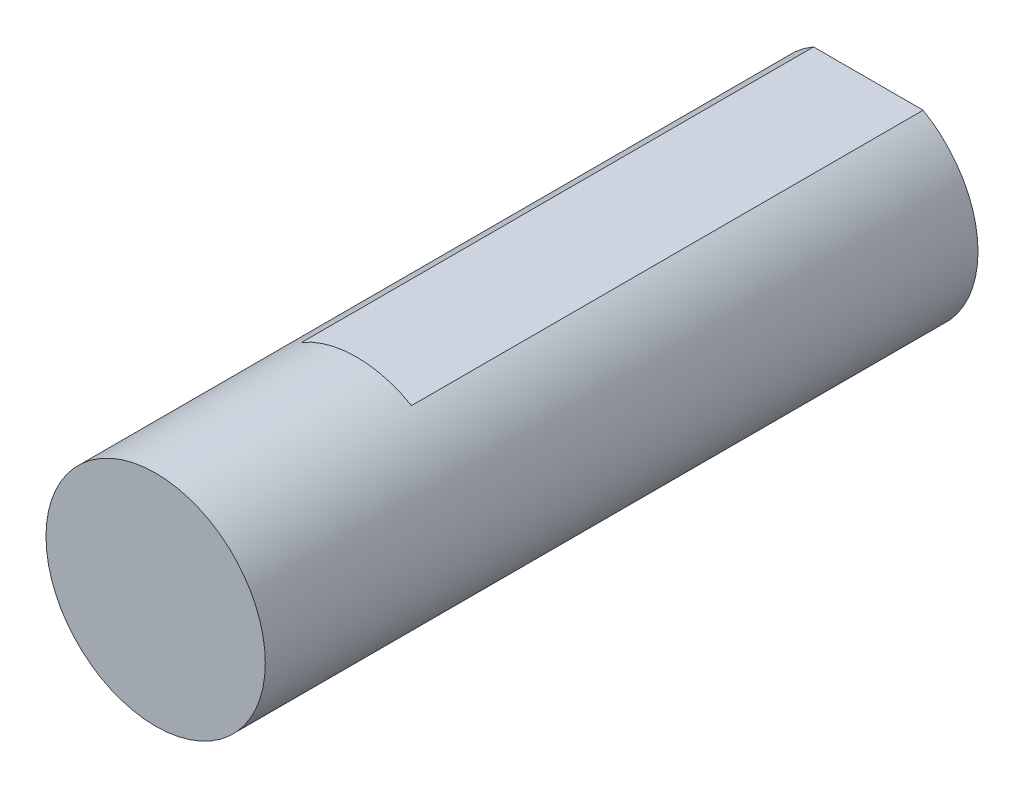
ISO-10303-21;
HEADER;
FILE_DESCRIPTION(('STEP AP214'),'2;1');
FILE_NAME('part.step','',(''),(''),'','','');
FILE_SCHEMA(('AUTOMOTIVE_DESIGN { 1 0 10303 214 1 1 1 1 }'));
ENDSEC;
DATA;
#1=APPLICATION_CONTEXT('core data for automotive mechanical design processes');
#2=APPLICATION_PROTOCOL_DEFINITION('international standard','automotive_design',2000,#1);
#3=PRODUCT_CONTEXT('',#1,'mechanical');
#4=PRODUCT('Part','Part','',(#3));
#5=PRODUCT_RELATED_PRODUCT_CATEGORY('part','',(#4));
#6=PRODUCT_DEFINITION_FORMATION('','',#4);
#7=PRODUCT_DEFINITION_CONTEXT('part definition',#1,'design');
#8=PRODUCT_DEFINITION('design','',#6,#7);
#9=PRODUCT_DEFINITION_SHAPE('','',#8);
#10=(LENGTH_UNIT() NAMED_UNIT(*) SI_UNIT(.MILLI.,.METRE.));
#11=(NAMED_UNIT(*) PLANE_ANGLE_UNIT() SI_UNIT($,.RADIAN.));
#12=(NAMED_UNIT(*) SI_UNIT($,.STERADIAN.) SOLID_ANGLE_UNIT());
#13=UNCERTAINTY_MEASURE_WITH_UNIT(LENGTH_MEASURE(1.E-05),#10,'distance_accuracy_value','');
#14=(GEOMETRIC_REPRESENTATION_CONTEXT(3) GLOBAL_UNCERTAINTY_ASSIGNED_CONTEXT((#13)) GLOBAL_UNIT_ASSIGNED_CONTEXT((#10,
#11,#12)) REPRESENTATION_CONTEXT('',''));
#15=CARTESIAN_POINT('',(0.,0.,0.));
#16=DIRECTION('',(0.,0.,1.));
#17=DIRECTION('',(1.,0.,0.));
#18=AXIS2_PLACEMENT_3D('',#15,#16,#17);
#19=CARTESIAN_POINT('',(0.,0.,39.));
#20=DIRECTION('',(0.,0.,-1.));
#21=DIRECTION('',(-1.,0.,0.));
#22=AXIS2_PLACEMENT_3D('',#19,#20,#21);
#23=CYLINDRICAL_SURFACE('',#22,6.);
#24=CARTESIAN_POINT('',(0.,0.,39.));
#25=DIRECTION('',(0.,0.,1.));
#26=DIRECTION('',(1.,0.,0.));
#27=AXIS2_PLACEMENT_3D('',#24,#25,#26);
#28=CIRCLE('',#27,6.);
#29=CARTESIAN_POINT('',(6.,0.,39.));
#30=VERTEX_POINT('',#29);
#31=EDGE_CURVE('E11',#30,#30,#28,.T.);
#32=ORIENTED_EDGE('',*,*,#31,.F.);
#33=EDGE_LOOP('',(#32));
#34=FACE_BOUND('',#33,.T.);
#35=CARTESIAN_POINT('',(0.,0.,28.));
#36=DIRECTION('',(0.,0.,-1.));
#37=DIRECTION('',(-1.,0.,0.));
#38=AXIS2_PLACEMENT_3D('',#35,#36,#37);
#39=CIRCLE('',#38,6.);
#40=CARTESIAN_POINT('',(-3.,5.19615242270663,28.));
#41=VERTEX_POINT('',#40);
#42=CARTESIAN_POINT('',(3.,5.19615242270663,28.));
#43=VERTEX_POINT('',#42);
#44=EDGE_CURVE('E77',#41,#43,#39,.T.);
#45=ORIENTED_EDGE('',*,*,#44,.F.);
#46=DIRECTION('',(0.,0.,-1.));
#47=VECTOR('',#46,1.);
#48=CARTESIAN_POINT('',(-3.,5.19615242270663,28.));
#49=LINE('',#48,#47);
#50=CARTESIAN_POINT('',(-3.,5.19615242270663,0.));
#51=VERTEX_POINT('',#50);
#52=EDGE_CURVE('E66',#41,#51,#49,.T.);
#53=ORIENTED_EDGE('',*,*,#52,.T.);
#54=CARTESIAN_POINT('',(0.,0.,0.));
#55=DIRECTION('',(0.,0.,1.));
#56=DIRECTION('',(1.,0.,0.));
#57=AXIS2_PLACEMENT_3D('',#54,#55,#56);
#58=CIRCLE('',#57,6.);
#59=CARTESIAN_POINT('',(3.,5.19615242270663,0.));
#60=VERTEX_POINT('',#59);
#61=EDGE_CURVE('E48',#51,#60,#58,.T.);
#62=ORIENTED_EDGE('',*,*,#61,.T.);
#63=DIRECTION('',(0.,0.,-1.));
#64=VECTOR('',#63,1.);
#65=CARTESIAN_POINT('',(3.,5.19615242270663,28.));
#66=LINE('',#65,#64);
#67=EDGE_CURVE('E60',#43,#60,#66,.T.);
#68=ORIENTED_EDGE('',*,*,#67,.F.);
#69=EDGE_LOOP('',(#45,#53,#62,#68));
#70=FACE_BOUND('',#69,.T.);
#71=ADVANCED_FACE('F45',(#34,#70),#23,.T.);
#72=CARTESIAN_POINT('',(0.,0.,39.));
#73=DIRECTION('',(0.,0.,1.));
#74=DIRECTION('',(1.,0.,0.));
#75=AXIS2_PLACEMENT_3D('',#72,#73,#74);
#76=PLANE('',#75);
#77=ORIENTED_EDGE('',*,*,#31,.T.);
#78=EDGE_LOOP('',(#77));
#79=FACE_BOUND('',#78,.T.);
#80=ADVANCED_FACE('F101',(#79),#76,.T.);
#81=CARTESIAN_POINT('',(0.,0.,0.));
#82=DIRECTION('',(0.,0.,1.));
#83=DIRECTION('',(1.,0.,0.));
#84=AXIS2_PLACEMENT_3D('',#81,#82,#83);
#85=PLANE('',#84);
#86=ORIENTED_EDGE('',*,*,#61,.F.);
#87=DIRECTION('',(-1.,0.,0.));
#88=VECTOR('',#87,1.);
#89=CARTESIAN_POINT('',(0.,5.19615242270663,0.));
#90=LINE('',#89,#88);
#91=EDGE_CURVE('E71',#60,#51,#90,.T.);
#92=ORIENTED_EDGE('',*,*,#91,.F.);
#93=EDGE_LOOP('',(#86,#92));
#94=FACE_BOUND('',#93,.T.);
#95=ADVANCED_FACE('F83',(#94),#85,.F.);
#96=CARTESIAN_POINT('',(0.,5.19615242270663,28.));
#97=DIRECTION('',(0.,-1.,0.));
#98=DIRECTION('',(0.,0.,-1.));
#99=AXIS2_PLACEMENT_3D('',#96,#97,#98);
#100=PLANE('',#99);
#101=ORIENTED_EDGE('',*,*,#91,.T.);
#102=ORIENTED_EDGE('',*,*,#52,.F.);
#103=DIRECTION('',(-1.,0.,0.));
#104=VECTOR('',#103,1.);
#105=CARTESIAN_POINT('',(0.,5.19615242270663,28.));
#106=LINE('',#105,#104);
#107=EDGE_CURVE('E87',#43,#41,#106,.T.);
#108=ORIENTED_EDGE('',*,*,#107,.F.);
#109=ORIENTED_EDGE('',*,*,#67,.T.);
#110=EDGE_LOOP('',(#101,#102,#108,#109));
#111=FACE_BOUND('',#110,.T.);
#112=ADVANCED_FACE('F72',(#111),#100,.F.);
#113=CARTESIAN_POINT('',(0.,0.,28.));
#114=DIRECTION('',(0.,0.,-1.));
#115=DIRECTION('',(-1.,0.,0.));
#116=AXIS2_PLACEMENT_3D('',#113,#114,#115);
#117=PLANE('',#116);
#118=ORIENTED_EDGE('',*,*,#44,.T.);
#119=ORIENTED_EDGE('',*,*,#107,.T.);
#120=EDGE_LOOP('',(#118,#119));
#121=FACE_BOUND('',#120,.T.);
#122=ADVANCED_FACE('F93',(#121),#117,.T.);
#123=CLOSED_SHELL('',(#71,#80,#95,#112,#122));
#124=MANIFOLD_SOLID_BREP('B2',#123);
#125=ADVANCED_BREP_SHAPE_REPRESENTATION('',(#18,#124),#14);
#126=SHAPE_DEFINITION_REPRESENTATION(#9,#125);
ENDSEC;
END-ISO-10303-21;
